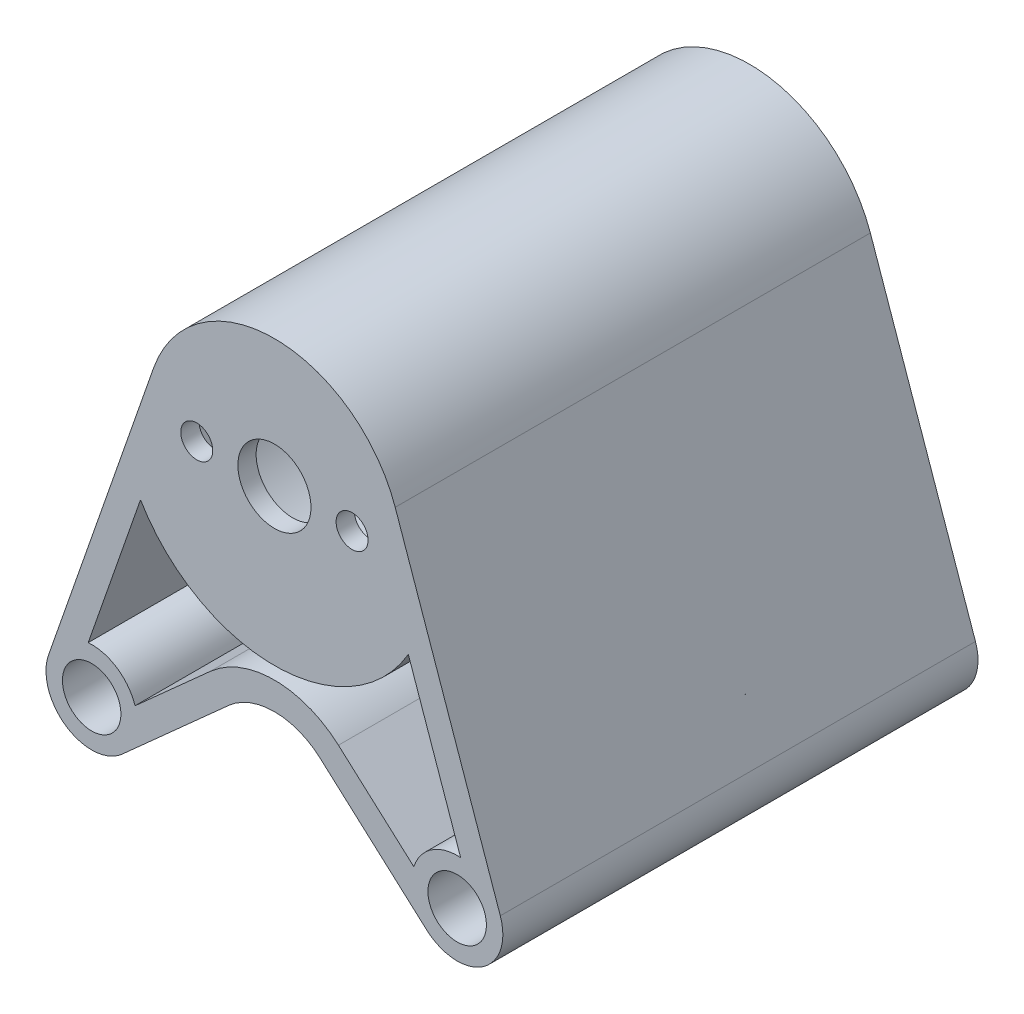
ISO-10303-21;
HEADER;
FILE_DESCRIPTION(('STEP AP214'),'2;1');
FILE_NAME('part.step','',(''),(''),'','','');
FILE_SCHEMA(('AUTOMOTIVE_DESIGN { 1 0 10303 214 1 1 1 1 }'));
ENDSEC;
DATA;
#1=APPLICATION_CONTEXT('core data for automotive mechanical design processes');
#2=APPLICATION_PROTOCOL_DEFINITION('international standard','automotive_design',2000,#1);
#3=PRODUCT_CONTEXT('',#1,'mechanical');
#4=PRODUCT('Part','Part','',(#3));
#5=PRODUCT_RELATED_PRODUCT_CATEGORY('part','',(#4));
#6=PRODUCT_DEFINITION_FORMATION('','',#4);
#7=PRODUCT_DEFINITION_CONTEXT('part definition',#1,'design');
#8=PRODUCT_DEFINITION('design','',#6,#7);
#9=PRODUCT_DEFINITION_SHAPE('','',#8);
#10=(LENGTH_UNIT() NAMED_UNIT(*) SI_UNIT(.MILLI.,.METRE.));
#11=(NAMED_UNIT(*) PLANE_ANGLE_UNIT() SI_UNIT($,.RADIAN.));
#12=(NAMED_UNIT(*) SI_UNIT($,.STERADIAN.) SOLID_ANGLE_UNIT());
#13=UNCERTAINTY_MEASURE_WITH_UNIT(LENGTH_MEASURE(1.E-05),#10,'distance_accuracy_value','');
#14=(GEOMETRIC_REPRESENTATION_CONTEXT(3) GLOBAL_UNCERTAINTY_ASSIGNED_CONTEXT((#13)) GLOBAL_UNIT_ASSIGNED_CONTEXT((#10,
#11,#12)) REPRESENTATION_CONTEXT('',''));
#15=CARTESIAN_POINT('',(0.,0.,0.));
#16=DIRECTION('',(0.,0.,1.));
#17=DIRECTION('',(1.,0.,0.));
#18=AXIS2_PLACEMENT_3D('',#15,#16,#17);
#19=CARTESIAN_POINT('',(0.,0.,2.));
#20=DIRECTION('',(0.,0.,-1.));
#21=DIRECTION('',(-1.,0.,0.));
#22=AXIS2_PLACEMENT_3D('',#19,#20,#21);
#23=CYLINDRICAL_SURFACE('',#22,14.);
#24=DIRECTION('',(0.,0.,1.));
#25=VECTOR('',#24,1.);
#26=CARTESIAN_POINT('',(-13.2184275462159,4.61228503081076,-113.789757213538));
#27=LINE('',#26,#25);
#28=CARTESIAN_POINT('',(-13.2184275462159,4.61228503081076,-50.));
#29=VERTEX_POINT('',#28);
#30=CARTESIAN_POINT('',(-13.2184275462159,4.61228503081076,2.));
#31=VERTEX_POINT('',#30);
#32=EDGE_CURVE('E70',#29,#31,#27,.T.);
#33=ORIENTED_EDGE('',*,*,#32,.T.);
#34=CARTESIAN_POINT('',(0.,0.,2.));
#35=DIRECTION('',(0.,0.,1.));
#36=DIRECTION('',(1.,0.,0.));
#37=AXIS2_PLACEMENT_3D('',#34,#35,#36);
#38=CIRCLE('',#37,14.);
#39=CARTESIAN_POINT('',(13.2184275462159,4.61228503081065,2.));
#40=VERTEX_POINT('',#39);
#41=EDGE_CURVE('E12',#40,#31,#38,.T.);
#42=ORIENTED_EDGE('',*,*,#41,.F.);
#43=DIRECTION('',(0.,0.,1.));
#44=VECTOR('',#43,1.);
#45=CARTESIAN_POINT('',(13.2184275462159,4.61228503081065,-113.789757213538));
#46=LINE('',#45,#44);
#47=CARTESIAN_POINT('',(13.2184275462159,4.61228503081065,-50.));
#48=VERTEX_POINT('',#47);
#49=EDGE_CURVE('E247',#48,#40,#46,.T.);
#50=ORIENTED_EDGE('',*,*,#49,.F.);
#51=CARTESIAN_POINT('',(0.,0.,-50.));
#52=DIRECTION('',(0.,0.,-1.));
#53=DIRECTION('',(-1.,0.,0.));
#54=AXIS2_PLACEMENT_3D('',#51,#52,#53);
#55=CIRCLE('',#54,14.);
#56=EDGE_CURVE('E199',#29,#48,#55,.T.);
#57=ORIENTED_EDGE('',*,*,#56,.F.);
#58=EDGE_LOOP('',(#33,#42,#50,#57));
#59=FACE_BOUND('',#58,.T.);
#60=ADVANCED_FACE('F53',(#59),#23,.T.);
#61=CARTESIAN_POINT('',(0.,0.,0.));
#62=DIRECTION('',(0.,0.,1.));
#63=DIRECTION('',(1.,0.,0.));
#64=AXIS2_PLACEMENT_3D('',#61,#62,#63);
#65=PLANE('',#64);
#66=CARTESIAN_POINT('',(8.49999999999959,1.32488214439315E-12,0.));
#67=DIRECTION('',(0.,0.,1.));
#68=DIRECTION('',(1.,0.,0.));
#69=AXIS2_PLACEMENT_3D('',#66,#67,#68);
#70=CIRCLE('',#69,1.75000000000002);
#71=CARTESIAN_POINT('',(10.2499999999996,1.32488214439315E-12,0.));
#72=VERTEX_POINT('',#71);
#73=EDGE_CURVE('E57',#72,#72,#70,.T.);
#74=ORIENTED_EDGE('',*,*,#73,.T.);
#75=EDGE_LOOP('',(#74));
#76=FACE_BOUND('',#75,.T.);
#77=CARTESIAN_POINT('',(-8.50000000000041,1.30695204254545E-12,0.));
#78=DIRECTION('',(0.,0.,1.));
#79=DIRECTION('',(1.,0.,0.));
#80=AXIS2_PLACEMENT_3D('',#77,#78,#79);
#81=CIRCLE('',#80,1.75000000000003);
#82=CARTESIAN_POINT('',(-6.75000000000038,1.30695204254545E-12,0.));
#83=VERTEX_POINT('',#82);
#84=EDGE_CURVE('E263',#83,#83,#81,.T.);
#85=ORIENTED_EDGE('',*,*,#84,.T.);
#86=EDGE_LOOP('',(#85));
#87=FACE_BOUND('',#86,.T.);
#88=CARTESIAN_POINT('',(0.,0.,0.));
#89=DIRECTION('',(0.,0.,1.));
#90=DIRECTION('',(1.,0.,0.));
#91=AXIS2_PLACEMENT_3D('',#88,#89,#90);
#92=CIRCLE('',#91,4.);
#93=CARTESIAN_POINT('',(4.,0.,0.));
#94=VERTEX_POINT('',#93);
#95=EDGE_CURVE('E202',#94,#94,#92,.T.);
#96=ORIENTED_EDGE('',*,*,#95,.T.);
#97=EDGE_LOOP('',(#96));
#98=FACE_BOUND('',#97,.T.);
#99=CARTESIAN_POINT('',(0.,0.,0.));
#100=DIRECTION('',(0.,0.,1.));
#101=DIRECTION('',(1.,0.,0.));
#102=AXIS2_PLACEMENT_3D('',#99,#100,#101);
#103=CIRCLE('',#102,13.15);
#104=CARTESIAN_POINT('',(13.15,0.,0.));
#105=VERTEX_POINT('',#104);
#106=EDGE_CURVE('E377',#105,#105,#103,.F.);
#107=ORIENTED_EDGE('',*,*,#106,.T.);
#108=EDGE_LOOP('',(#107));
#109=FACE_BOUND('',#108,.T.);
#110=ADVANCED_FACE('F270',(#76,#87,#98,#109),#65,.F.);
#111=CARTESIAN_POINT('',(8.49999999999959,1.32488214439315E-12,2.));
#112=DIRECTION('',(0.,0.,-1.));
#113=DIRECTION('',(-1.,0.,0.));
#114=AXIS2_PLACEMENT_3D('',#111,#112,#113);
#115=CYLINDRICAL_SURFACE('',#114,1.75000000000002);
#116=CARTESIAN_POINT('',(8.49999999999959,1.32488214439315E-12,2.));
#117=DIRECTION('',(0.,0.,1.));
#118=DIRECTION('',(1.,0.,0.));
#119=AXIS2_PLACEMENT_3D('',#116,#117,#118);
#120=CIRCLE('',#119,1.75000000000002);
#121=CARTESIAN_POINT('',(10.2499999999996,1.32488214439315E-12,2.));
#122=VERTEX_POINT('',#121);
#123=EDGE_CURVE('E62',#122,#122,#120,.T.);
#124=ORIENTED_EDGE('',*,*,#123,.T.);
#125=EDGE_LOOP('',(#124));
#126=FACE_BOUND('',#125,.T.);
#127=ORIENTED_EDGE('',*,*,#73,.F.);
#128=EDGE_LOOP('',(#127));
#129=FACE_BOUND('',#128,.T.);
#130=ADVANCED_FACE('F272',(#126,#129),#115,.F.);
#131=CARTESIAN_POINT('',(-8.50000000000041,1.30695204254545E-12,2.));
#132=DIRECTION('',(0.,0.,-1.));
#133=DIRECTION('',(-1.,0.,0.));
#134=AXIS2_PLACEMENT_3D('',#131,#132,#133);
#135=CYLINDRICAL_SURFACE('',#134,1.75000000000003);
#136=CARTESIAN_POINT('',(-8.50000000000041,1.30695204254545E-12,2.));
#137=DIRECTION('',(0.,0.,1.));
#138=DIRECTION('',(1.,0.,0.));
#139=AXIS2_PLACEMENT_3D('',#136,#137,#138);
#140=CIRCLE('',#139,1.75000000000003);
#141=CARTESIAN_POINT('',(-6.75000000000038,1.30695204254545E-12,2.));
#142=VERTEX_POINT('',#141);
#143=EDGE_CURVE('E257',#142,#142,#140,.T.);
#144=ORIENTED_EDGE('',*,*,#143,.T.);
#145=EDGE_LOOP('',(#144));
#146=FACE_BOUND('',#145,.T.);
#147=ORIENTED_EDGE('',*,*,#84,.F.);
#148=EDGE_LOOP('',(#147));
#149=FACE_BOUND('',#148,.T.);
#150=ADVANCED_FACE('F274',(#146,#149),#135,.F.);
#151=CARTESIAN_POINT('',(0.,0.,2.));
#152=DIRECTION('',(0.,0.,-1.));
#153=DIRECTION('',(-1.,0.,0.));
#154=AXIS2_PLACEMENT_3D('',#151,#152,#153);
#155=CYLINDRICAL_SURFACE('',#154,4.);
#156=CARTESIAN_POINT('',(0.,0.,2.));
#157=DIRECTION('',(0.,0.,1.));
#158=DIRECTION('',(1.,0.,0.));
#159=AXIS2_PLACEMENT_3D('',#156,#157,#158);
#160=CIRCLE('',#159,4.);
#161=CARTESIAN_POINT('',(4.,0.,2.));
#162=VERTEX_POINT('',#161);
#163=EDGE_CURVE('E254',#162,#162,#160,.T.);
#164=ORIENTED_EDGE('',*,*,#163,.T.);
#165=EDGE_LOOP('',(#164));
#166=FACE_BOUND('',#165,.T.);
#167=ORIENTED_EDGE('',*,*,#95,.F.);
#168=EDGE_LOOP('',(#167));
#169=FACE_BOUND('',#168,.T.);
#170=ADVANCED_FACE('F55',(#166,#169),#155,.F.);
#171=CARTESIAN_POINT('',(0.,0.,2.));
#172=DIRECTION('',(0.,0.,1.));
#173=DIRECTION('',(1.,0.,0.));
#174=AXIS2_PLACEMENT_3D('',#171,#172,#173);
#175=PLANE('',#174);
#176=CARTESIAN_POINT('',(19.9999999999998,-29.9999999999993,2.));
#177=DIRECTION('',(0.,0.,1.));
#178=DIRECTION('',(1.,0.,0.));
#179=AXIS2_PLACEMENT_3D('',#176,#177,#178);
#180=CIRCLE('',#179,3.19999999999996);
#181=CARTESIAN_POINT('',(23.1999999999998,-29.9999999999993,2.));
#182=VERTEX_POINT('',#181);
#183=EDGE_CURVE('E364',#182,#182,#180,.F.);
#184=ORIENTED_EDGE('',*,*,#183,.T.);
#185=EDGE_LOOP('',(#184));
#186=FACE_BOUND('',#185,.T.);
#187=CARTESIAN_POINT('',(-20.0000000000002,-29.9999999999993,2.));
#188=DIRECTION('',(0.,0.,1.));
#189=DIRECTION('',(1.,0.,0.));
#190=AXIS2_PLACEMENT_3D('',#187,#188,#189);
#191=CIRCLE('',#190,3.19999999999996);
#192=CARTESIAN_POINT('',(-16.8000000000002,-29.9999999999993,2.));
#193=VERTEX_POINT('',#192);
#194=EDGE_CURVE('E365',#193,#193,#191,.F.);
#195=ORIENTED_EDGE('',*,*,#194,.T.);
#196=EDGE_LOOP('',(#195));
#197=FACE_BOUND('',#196,.T.);
#198=ORIENTED_EDGE('',*,*,#163,.F.);
#199=EDGE_LOOP('',(#198));
#200=FACE_BOUND('',#199,.T.);
#201=ORIENTED_EDGE('',*,*,#143,.F.);
#202=EDGE_LOOP('',(#201));
#203=FACE_BOUND('',#202,.T.);
#204=ORIENTED_EDGE('',*,*,#123,.F.);
#205=EDGE_LOOP('',(#204));
#206=FACE_BOUND('',#205,.T.);
#207=ORIENTED_EDGE('',*,*,#41,.T.);
#208=DIRECTION('',(-0.329448930772197,-0.944173396158278,0.));
#209=VECTOR('',#208,1.);
#210=CARTESIAN_POINT('',(-13.2184275462159,4.61228503081076,2.));
#211=LINE('',#210,#209);
#212=CARTESIAN_POINT('',(-24.7208669807916,-28.3527553461384,2.));
#213=VERTEX_POINT('',#212);
#214=EDGE_CURVE('E401',#31,#213,#211,.T.);
#215=ORIENTED_EDGE('',*,*,#214,.T.);
#216=CARTESIAN_POINT('',(-20.0000000000002,-29.9999999999993,2.));
#217=DIRECTION('',(0.,0.,1.));
#218=DIRECTION('',(1.,0.,0.));
#219=AXIS2_PLACEMENT_3D('',#216,#217,#218);
#220=CIRCLE('',#219,4.99999999999997);
#221=CARTESIAN_POINT('',(-16.6637484038242,-33.7241677307833,2.));
#222=VERTEX_POINT('',#221);
#223=EDGE_CURVE('E394',#213,#222,#220,.T.);
#224=ORIENTED_EDGE('',*,*,#223,.T.);
#225=DIRECTION('',(-0.744833546156803,-0.667250319235204,0.));
#226=VECTOR('',#225,1.);
#227=CARTESIAN_POINT('',(9.34150446929246,-10.4276696461948,2.));
#228=LINE('',#227,#226);
#229=CARTESIAN_POINT('',(-5.00437739426418,-23.2792581689727,2.));
#230=VERTEX_POINT('',#229);
#231=EDGE_CURVE('E219',#230,#222,#228,.T.);
#232=ORIENTED_EDGE('',*,*,#231,.F.);
#233=CARTESIAN_POINT('',(-1.49764966330571E-13,-28.8655097651487,2.));
#234=DIRECTION('',(0.,0.,1.));
#235=DIRECTION('',(1.,0.,0.));
#236=AXIS2_PLACEMENT_3D('',#233,#234,#235);
#237=CIRCLE('',#236,7.5);
#238=CARTESIAN_POINT('',(5.00437739426388,-23.2792581689727,2.));
#239=VERTEX_POINT('',#238);
#240=EDGE_CURVE('E241',#239,#230,#237,.T.);
#241=ORIENTED_EDGE('',*,*,#240,.F.);
#242=DIRECTION('',(0.744833546156803,-0.667250319235204,0.));
#243=VECTOR('',#242,1.);
#244=CARTESIAN_POINT('',(-9.3415044692926,-10.4276696461949,2.));
#245=LINE('',#244,#243);
#246=CARTESIAN_POINT('',(16.6637484038238,-33.7241677307833,2.));
#247=VERTEX_POINT('',#246);
#248=EDGE_CURVE('E252',#239,#247,#245,.T.);
#249=ORIENTED_EDGE('',*,*,#248,.T.);
#250=CARTESIAN_POINT('',(19.9999999999998,-29.9999999999993,2.));
#251=DIRECTION('',(0.,0.,1.));
#252=DIRECTION('',(1.,0.,0.));
#253=AXIS2_PLACEMENT_3D('',#250,#251,#252);
#254=CIRCLE('',#253,5.);
#255=CARTESIAN_POINT('',(24.7208669807912,-28.3527553461384,2.));
#256=VERTEX_POINT('',#255);
#257=EDGE_CURVE('E404',#247,#256,#254,.T.);
#258=ORIENTED_EDGE('',*,*,#257,.T.);
#259=DIRECTION('',(0.329448930772189,-0.94417339615828,0.));
#260=VECTOR('',#259,1.);
#261=CARTESIAN_POINT('',(13.2184275462159,4.61228503081065,2.));
#262=LINE('',#261,#260);
#263=EDGE_CURVE('E249',#40,#256,#262,.T.);
#264=ORIENTED_EDGE('',*,*,#263,.F.);
#265=EDGE_LOOP('',(#207,#215,#224,#232,#241,#249,#258,#264));
#266=FACE_BOUND('',#265,.T.);
#267=DIRECTION('',(0.329448930772191,-0.94417339615828,0.));
#268=VECTOR('',#267,1.);
#269=CARTESIAN_POINT('',(10.3859073577411,3.62393823849409,2.));
#270=LINE('',#269,#268);
#271=CARTESIAN_POINT('',(14.6560535451456,-8.61394767117981,2.));
#272=VERTEX_POINT('',#271);
#273=CARTESIAN_POINT('',(20.3786221294306,-25.0143560813961,2.));
#274=VERTEX_POINT('',#273);
#275=EDGE_CURVE('E391',#272,#274,#270,.T.);
#276=ORIENTED_EDGE('',*,*,#275,.T.);
#277=CARTESIAN_POINT('',(15.2522432561235,-28.4319419969342,2.));
#278=VERTEX_POINT('',#277);
#279=EDGE_CURVE('E389',#274,#278,#254,.T.);
#280=ORIENTED_EDGE('',*,*,#279,.T.);
#281=DIRECTION('',(0.744833546156803,-0.667250319235204,0.));
#282=VECTOR('',#281,1.);
#283=CARTESIAN_POINT('',(-7.33975351158699,-8.19316900772455,2.));
#284=LINE('',#283,#282);
#285=CARTESIAN_POINT('',(7.00612835196949,-21.0447575305022,2.));
#286=VERTEX_POINT('',#285);
#287=EDGE_CURVE('E195',#286,#278,#284,.T.);
#288=ORIENTED_EDGE('',*,*,#287,.F.);
#289=CARTESIAN_POINT('',(-1.49764966330571E-13,-28.8655097651487,2.));
#290=DIRECTION('',(0.,0.,1.));
#291=DIRECTION('',(1.,0.,0.));
#292=AXIS2_PLACEMENT_3D('',#289,#290,#291);
#293=CIRCLE('',#292,10.5);
#294=CARTESIAN_POINT('',(-7.00612835196979,-21.0447575305022,2.));
#295=VERTEX_POINT('',#294);
#296=EDGE_CURVE('E191',#286,#295,#293,.T.);
#297=ORIENTED_EDGE('',*,*,#296,.T.);
#298=DIRECTION('',(-0.744833546156803,-0.667250319235204,0.));
#299=VECTOR('',#298,1.);
#300=CARTESIAN_POINT('',(7.33975351158686,-8.1931690077244,2.));
#301=LINE('',#300,#299);
#302=CARTESIAN_POINT('',(-15.2522432561238,-28.4319419969342,2.));
#303=VERTEX_POINT('',#302);
#304=EDGE_CURVE('E385',#295,#303,#301,.T.);
#305=ORIENTED_EDGE('',*,*,#304,.T.);
#306=CARTESIAN_POINT('',(-20.3786221294309,-25.0143560813961,2.));
#307=VERTEX_POINT('',#306);
#308=EDGE_CURVE('E382',#303,#307,#220,.T.);
#309=ORIENTED_EDGE('',*,*,#308,.T.);
#310=DIRECTION('',(-0.329448930772207,-0.944173396158274,0.));
#311=VECTOR('',#310,1.);
#312=CARTESIAN_POINT('',(-10.3859073577408,3.62393823849419,2.));
#313=LINE('',#312,#311);
#314=CARTESIAN_POINT('',(-14.6560535451456,-8.61394767117982,2.));
#315=VERTEX_POINT('',#314);
#316=EDGE_CURVE('E229',#315,#307,#313,.T.);
#317=ORIENTED_EDGE('',*,*,#316,.F.);
#318=CARTESIAN_POINT('',(0.,0.,2.));
#319=DIRECTION('',(0.,0.,1.));
#320=DIRECTION('',(1.,0.,0.));
#321=AXIS2_PLACEMENT_3D('',#318,#319,#320);
#322=CIRCLE('',#321,17.);
#323=EDGE_CURVE('E213',#315,#272,#322,.T.);
#324=ORIENTED_EDGE('',*,*,#323,.T.);
#325=EDGE_LOOP('',(#276,#280,#288,#297,#305,#309,#317,#324));
#326=FACE_BOUND('',#325,.T.);
#327=ADVANCED_FACE('F289',(#186,#197,#200,#203,#206,#266,#326),#175,.T.);
#328=CARTESIAN_POINT('',(0.,0.,-50.));
#329=DIRECTION('',(0.,0.,-1.));
#330=DIRECTION('',(-1.,0.,0.));
#331=AXIS2_PLACEMENT_3D('',#328,#329,#330);
#332=PLANE('',#331);
#333=CARTESIAN_POINT('',(19.9999999999998,-29.9999999999993,-50.));
#334=DIRECTION('',(0.,0.,-1.));
#335=DIRECTION('',(-1.,0.,0.));
#336=AXIS2_PLACEMENT_3D('',#333,#334,#335);
#337=CIRCLE('',#336,3.19999999999996);
#338=CARTESIAN_POINT('',(16.7999999999999,-29.9999999999993,-50.));
#339=VERTEX_POINT('',#338);
#340=EDGE_CURVE('E361',#339,#339,#337,.T.);
#341=ORIENTED_EDGE('',*,*,#340,.F.);
#342=EDGE_LOOP('',(#341));
#343=FACE_BOUND('',#342,.T.);
#344=CARTESIAN_POINT('',(-20.0000000000002,-29.9999999999993,-50.));
#345=DIRECTION('',(0.,0.,-1.));
#346=DIRECTION('',(-1.,0.,0.));
#347=AXIS2_PLACEMENT_3D('',#344,#345,#346);
#348=CIRCLE('',#347,3.19999999999996);
#349=CARTESIAN_POINT('',(-23.2000000000001,-29.9999999999993,-50.));
#350=VERTEX_POINT('',#349);
#351=EDGE_CURVE('E370',#350,#350,#348,.T.);
#352=ORIENTED_EDGE('',*,*,#351,.F.);
#353=EDGE_LOOP('',(#352));
#354=FACE_BOUND('',#353,.T.);
#355=CARTESIAN_POINT('',(0.,0.,-50.));
#356=DIRECTION('',(0.,0.,-1.));
#357=DIRECTION('',(-1.,0.,0.));
#358=AXIS2_PLACEMENT_3D('',#355,#356,#357);
#359=CIRCLE('',#358,13.15);
#360=CARTESIAN_POINT('',(-13.15,0.,-50.));
#361=VERTEX_POINT('',#360);
#362=EDGE_CURVE('E367',#361,#361,#359,.T.);
#363=ORIENTED_EDGE('',*,*,#362,.F.);
#364=EDGE_LOOP('',(#363));
#365=FACE_BOUND('',#364,.T.);
#366=ORIENTED_EDGE('',*,*,#56,.T.);
#367=DIRECTION('',(0.329448930772189,-0.944173396158281,0.));
#368=VECTOR('',#367,1.);
#369=CARTESIAN_POINT('',(13.2184275462159,4.61228503081065,-50.));
#370=LINE('',#369,#368);
#371=CARTESIAN_POINT('',(24.7208669807912,-28.3527553461384,-50.));
#372=VERTEX_POINT('',#371);
#373=EDGE_CURVE('E114',#48,#372,#370,.T.);
#374=ORIENTED_EDGE('',*,*,#373,.T.);
#375=CARTESIAN_POINT('',(19.9999999999998,-29.9999999999993,-50.));
#376=DIRECTION('',(0.,0.,-1.));
#377=DIRECTION('',(-1.,0.,0.));
#378=AXIS2_PLACEMENT_3D('',#375,#376,#377);
#379=CIRCLE('',#378,5.);
#380=CARTESIAN_POINT('',(16.6637484038238,-33.7241677307833,-50.));
#381=VERTEX_POINT('',#380);
#382=EDGE_CURVE('E108',#381,#372,#379,.F.);
#383=ORIENTED_EDGE('',*,*,#382,.F.);
#384=DIRECTION('',(0.744833546156803,-0.667250319235204,0.));
#385=VECTOR('',#384,1.);
#386=CARTESIAN_POINT('',(-9.3415044692926,-10.4276696461949,-50.));
#387=LINE('',#386,#385);
#388=CARTESIAN_POINT('',(5.00437739426388,-23.2792581689727,-50.));
#389=VERTEX_POINT('',#388);
#390=EDGE_CURVE('E207',#389,#381,#387,.T.);
#391=ORIENTED_EDGE('',*,*,#390,.F.);
#392=CARTESIAN_POINT('',(-1.49764966330571E-13,-28.8655097651487,-50.));
#393=DIRECTION('',(0.,0.,-1.));
#394=DIRECTION('',(-1.,0.,0.));
#395=AXIS2_PLACEMENT_3D('',#392,#393,#394);
#396=CIRCLE('',#395,7.5);
#397=CARTESIAN_POINT('',(-5.00437739426418,-23.2792581689727,-50.));
#398=VERTEX_POINT('',#397);
#399=EDGE_CURVE('E210',#389,#398,#396,.F.);
#400=ORIENTED_EDGE('',*,*,#399,.T.);
#401=DIRECTION('',(-0.744833546156803,-0.667250319235204,0.));
#402=VECTOR('',#401,1.);
#403=CARTESIAN_POINT('',(9.34150446929246,-10.4276696461948,-50.));
#404=LINE('',#403,#402);
#405=CARTESIAN_POINT('',(-16.6637484038242,-33.7241677307833,-50.));
#406=VERTEX_POINT('',#405);
#407=EDGE_CURVE('E212',#398,#406,#404,.T.);
#408=ORIENTED_EDGE('',*,*,#407,.T.);
#409=CARTESIAN_POINT('',(-20.0000000000002,-29.9999999999993,-50.));
#410=DIRECTION('',(0.,0.,-1.));
#411=DIRECTION('',(-1.,0.,0.));
#412=AXIS2_PLACEMENT_3D('',#409,#410,#411);
#413=CIRCLE('',#412,4.99999999999997);
#414=CARTESIAN_POINT('',(-24.7208669807916,-28.3527553461384,-50.));
#415=VERTEX_POINT('',#414);
#416=EDGE_CURVE('E215',#415,#406,#413,.F.);
#417=ORIENTED_EDGE('',*,*,#416,.F.);
#418=DIRECTION('',(-0.329448930772197,-0.944173396158278,0.));
#419=VECTOR('',#418,1.);
#420=CARTESIAN_POINT('',(-13.2184275462159,4.61228503081076,-50.));
#421=LINE('',#420,#419);
#422=EDGE_CURVE('E220',#29,#415,#421,.T.);
#423=ORIENTED_EDGE('',*,*,#422,.F.);
#424=EDGE_LOOP('',(#366,#374,#383,#391,#400,#408,#417,#423));
#425=FACE_BOUND('',#424,.T.);
#426=DIRECTION('',(0.329448930772191,-0.94417339615828,0.));
#427=VECTOR('',#426,1.);
#428=CARTESIAN_POINT('',(10.3859073577411,3.62393823849409,-50.));
#429=LINE('',#428,#427);
#430=CARTESIAN_POINT('',(14.6560535451456,-8.61394767117981,-50.));
#431=VERTEX_POINT('',#430);
#432=CARTESIAN_POINT('',(20.3786221294306,-25.0143560813961,-50.));
#433=VERTEX_POINT('',#432);
#434=EDGE_CURVE('E238',#431,#433,#429,.T.);
#435=ORIENTED_EDGE('',*,*,#434,.F.);
#436=CARTESIAN_POINT('',(0.,0.,-50.));
#437=DIRECTION('',(0.,0.,-1.));
#438=DIRECTION('',(-1.,0.,0.));
#439=AXIS2_PLACEMENT_3D('',#436,#437,#438);
#440=CIRCLE('',#439,17.);
#441=CARTESIAN_POINT('',(-14.6560535451456,-8.61394767117982,-50.));
#442=VERTEX_POINT('',#441);
#443=EDGE_CURVE('E227',#442,#431,#440,.F.);
#444=ORIENTED_EDGE('',*,*,#443,.F.);
#445=DIRECTION('',(-0.329448930772207,-0.944173396158274,0.));
#446=VECTOR('',#445,1.);
#447=CARTESIAN_POINT('',(-10.3859073577408,3.62393823849419,-50.));
#448=LINE('',#447,#446);
#449=CARTESIAN_POINT('',(-20.3786221294309,-25.0143560813962,-50.));
#450=VERTEX_POINT('',#449);
#451=EDGE_CURVE('E200',#442,#450,#448,.T.);
#452=ORIENTED_EDGE('',*,*,#451,.T.);
#453=CARTESIAN_POINT('',(-20.0000000000002,-29.9999999999993,-50.));
#454=DIRECTION('',(0.,0.,-1.));
#455=DIRECTION('',(-1.,0.,0.));
#456=AXIS2_PLACEMENT_3D('',#453,#454,#455);
#457=CIRCLE('',#456,4.99999999999997);
#458=CARTESIAN_POINT('',(-15.2522432561238,-28.4319419969342,-50.));
#459=VERTEX_POINT('',#458);
#460=EDGE_CURVE('E232',#459,#450,#457,.F.);
#461=ORIENTED_EDGE('',*,*,#460,.F.);
#462=DIRECTION('',(-0.744833546156803,-0.667250319235204,0.));
#463=VECTOR('',#462,1.);
#464=CARTESIAN_POINT('',(7.33975351158686,-8.1931690077244,-50.));
#465=LINE('',#464,#463);
#466=CARTESIAN_POINT('',(-7.00612835196979,-21.0447575305022,-50.));
#467=VERTEX_POINT('',#466);
#468=EDGE_CURVE('E174',#467,#459,#465,.T.);
#469=ORIENTED_EDGE('',*,*,#468,.F.);
#470=CARTESIAN_POINT('',(-1.49764966330571E-13,-28.8655097651487,-50.));
#471=DIRECTION('',(0.,0.,-1.));
#472=DIRECTION('',(-1.,0.,0.));
#473=AXIS2_PLACEMENT_3D('',#470,#471,#472);
#474=CIRCLE('',#473,10.5);
#475=CARTESIAN_POINT('',(7.00612835196949,-21.0447575305022,-50.));
#476=VERTEX_POINT('',#475);
#477=EDGE_CURVE('E177',#476,#467,#474,.F.);
#478=ORIENTED_EDGE('',*,*,#477,.F.);
#479=DIRECTION('',(0.744833546156803,-0.667250319235204,0.));
#480=VECTOR('',#479,1.);
#481=CARTESIAN_POINT('',(-7.33975351158699,-8.19316900772455,-50.));
#482=LINE('',#481,#480);
#483=CARTESIAN_POINT('',(15.2522432561235,-28.4319419969342,-50.));
#484=VERTEX_POINT('',#483);
#485=EDGE_CURVE('E181',#476,#484,#482,.T.);
#486=ORIENTED_EDGE('',*,*,#485,.T.);
#487=CARTESIAN_POINT('',(19.9999999999998,-29.9999999999993,-50.));
#488=DIRECTION('',(0.,0.,-1.));
#489=DIRECTION('',(-1.,0.,0.));
#490=AXIS2_PLACEMENT_3D('',#487,#488,#489);
#491=CIRCLE('',#490,5.);
#492=EDGE_CURVE('E79',#433,#484,#491,.F.);
#493=ORIENTED_EDGE('',*,*,#492,.F.);
#494=EDGE_LOOP('',(#435,#444,#452,#461,#469,#478,#486,#493));
#495=FACE_BOUND('',#494,.T.);
#496=ADVANCED_FACE('F179',(#343,#354,#365,#425,#495),#332,.T.);
#497=CARTESIAN_POINT('',(10.3859073577411,3.62393823849409,-113.789757213538));
#498=DIRECTION('',(-0.94417339615828,-0.329448930772191,0.));
#499=DIRECTION('',(0.329448930772191,-0.94417339615828,0.));
#500=AXIS2_PLACEMENT_3D('',#497,#498,#499);
#501=PLANE('',#500);
#502=DIRECTION('',(0.,0.,1.));
#503=VECTOR('',#502,1.);
#504=CARTESIAN_POINT('',(14.6560535451456,-8.61394767117981,-113.789757213538));
#505=LINE('',#504,#503);
#506=EDGE_CURVE('E224',#431,#272,#505,.T.);
#507=ORIENTED_EDGE('',*,*,#506,.F.);
#508=ORIENTED_EDGE('',*,*,#434,.T.);
#509=DIRECTION('',(0.,0.,1.));
#510=VECTOR('',#509,1.);
#511=CARTESIAN_POINT('',(20.3786221294306,-25.0143560813961,-113.789757213538));
#512=LINE('',#511,#510);
#513=EDGE_CURVE('E236',#433,#274,#512,.T.);
#514=ORIENTED_EDGE('',*,*,#513,.T.);
#515=ORIENTED_EDGE('',*,*,#275,.F.);
#516=EDGE_LOOP('',(#507,#508,#514,#515));
#517=FACE_BOUND('',#516,.T.);
#518=ADVANCED_FACE('F295',(#517),#501,.T.);
#519=CARTESIAN_POINT('',(0.,0.,-113.789757213538));
#520=DIRECTION('',(0.,0.,1.));
#521=DIRECTION('',(1.,0.,0.));
#522=AXIS2_PLACEMENT_3D('',#519,#520,#521);
#523=CYLINDRICAL_SURFACE('',#522,17.);
#524=DIRECTION('',(0.,0.,1.));
#525=VECTOR('',#524,1.);
#526=CARTESIAN_POINT('',(-14.6560535451456,-8.61394767117982,-113.789757213538));
#527=LINE('',#526,#525);
#528=EDGE_CURVE('E226',#442,#315,#527,.T.);
#529=ORIENTED_EDGE('',*,*,#528,.F.);
#530=ORIENTED_EDGE('',*,*,#443,.T.);
#531=ORIENTED_EDGE('',*,*,#506,.T.);
#532=ORIENTED_EDGE('',*,*,#323,.F.);
#533=EDGE_LOOP('',(#529,#530,#531,#532));
#534=FACE_BOUND('',#533,.T.);
#535=ADVANCED_FACE('F320',(#534),#523,.T.);
#536=CARTESIAN_POINT('',(-10.3859073577408,3.62393823849419,-113.789757213538));
#537=DIRECTION('',(-0.944173396158274,0.329448930772207,0.));
#538=DIRECTION('',(-0.329448930772207,-0.944173396158274,0.));
#539=AXIS2_PLACEMENT_3D('',#536,#537,#538);
#540=PLANE('',#539);
#541=ORIENTED_EDGE('',*,*,#451,.F.);
#542=ORIENTED_EDGE('',*,*,#528,.T.);
#543=ORIENTED_EDGE('',*,*,#316,.T.);
#544=DIRECTION('',(0.,0.,1.));
#545=VECTOR('',#544,1.);
#546=CARTESIAN_POINT('',(-20.3786221294309,-25.0143560813961,-113.789757213538));
#547=LINE('',#546,#545);
#548=EDGE_CURVE('E230',#450,#307,#547,.T.);
#549=ORIENTED_EDGE('',*,*,#548,.F.);
#550=EDGE_LOOP('',(#541,#542,#543,#549));
#551=FACE_BOUND('',#550,.T.);
#552=ADVANCED_FACE('F324',(#551),#540,.F.);
#553=CARTESIAN_POINT('',(-20.0000000000002,-29.9999999999993,-113.789757213538));
#554=DIRECTION('',(0.,0.,1.));
#555=DIRECTION('',(1.,0.,0.));
#556=AXIS2_PLACEMENT_3D('',#553,#554,#555);
#557=CYLINDRICAL_SURFACE('',#556,4.99999999999997);
#558=DIRECTION('',(0.,0.,1.));
#559=VECTOR('',#558,1.);
#560=CARTESIAN_POINT('',(-15.2522432561238,-28.4319419969342,-113.789757213538));
#561=LINE('',#560,#559);
#562=EDGE_CURVE('E185',#459,#303,#561,.T.);
#563=ORIENTED_EDGE('',*,*,#562,.F.);
#564=ORIENTED_EDGE('',*,*,#460,.T.);
#565=ORIENTED_EDGE('',*,*,#548,.T.);
#566=ORIENTED_EDGE('',*,*,#308,.F.);
#567=EDGE_LOOP('',(#563,#564,#565,#566));
#568=FACE_BOUND('',#567,.T.);
#569=ADVANCED_FACE('F328',(#568),#557,.T.);
#570=CARTESIAN_POINT('',(7.33975351158686,-8.1931690077244,-113.789757213538));
#571=DIRECTION('',(-0.667250319235204,0.744833546156803,0.));
#572=DIRECTION('',(-0.744833546156803,-0.667250319235204,0.));
#573=AXIS2_PLACEMENT_3D('',#570,#571,#572);
#574=PLANE('',#573);
#575=DIRECTION('',(0.,0.,1.));
#576=VECTOR('',#575,1.);
#577=CARTESIAN_POINT('',(-7.00612835196979,-21.0447575305022,-113.789757213538));
#578=LINE('',#577,#576);
#579=EDGE_CURVE('E184',#467,#295,#578,.T.);
#580=ORIENTED_EDGE('',*,*,#579,.F.);
#581=ORIENTED_EDGE('',*,*,#468,.T.);
#582=ORIENTED_EDGE('',*,*,#562,.T.);
#583=ORIENTED_EDGE('',*,*,#304,.F.);
#584=EDGE_LOOP('',(#580,#581,#582,#583));
#585=FACE_BOUND('',#584,.T.);
#586=ADVANCED_FACE('F332',(#585),#574,.T.);
#587=CARTESIAN_POINT('',(-1.49764966330571E-13,-28.8655097651487,-113.789757213538));
#588=DIRECTION('',(0.,0.,1.));
#589=DIRECTION('',(1.,0.,0.));
#590=AXIS2_PLACEMENT_3D('',#587,#588,#589);
#591=CYLINDRICAL_SURFACE('',#590,10.5);
#592=DIRECTION('',(0.,0.,1.));
#593=VECTOR('',#592,1.);
#594=CARTESIAN_POINT('',(7.00612835196949,-21.0447575305022,-113.789757213538));
#595=LINE('',#594,#593);
#596=EDGE_CURVE('E188',#476,#286,#595,.T.);
#597=ORIENTED_EDGE('',*,*,#596,.F.);
#598=ORIENTED_EDGE('',*,*,#477,.T.);
#599=ORIENTED_EDGE('',*,*,#579,.T.);
#600=ORIENTED_EDGE('',*,*,#296,.F.);
#601=EDGE_LOOP('',(#597,#598,#599,#600));
#602=FACE_BOUND('',#601,.T.);
#603=ADVANCED_FACE('F189',(#602),#591,.T.);
#604=CARTESIAN_POINT('',(-7.33975351158699,-8.19316900772455,-113.789757213538));
#605=DIRECTION('',(-0.667250319235204,-0.744833546156803,0.));
#606=DIRECTION('',(0.744833546156803,-0.667250319235204,0.));
#607=AXIS2_PLACEMENT_3D('',#604,#605,#606);
#608=PLANE('',#607);
#609=ORIENTED_EDGE('',*,*,#485,.F.);
#610=ORIENTED_EDGE('',*,*,#596,.T.);
#611=ORIENTED_EDGE('',*,*,#287,.T.);
#612=DIRECTION('',(0.,0.,1.));
#613=VECTOR('',#612,1.);
#614=CARTESIAN_POINT('',(15.2522432561235,-28.4319419969342,-113.789757213538));
#615=LINE('',#614,#613);
#616=EDGE_CURVE('E198',#484,#278,#615,.T.);
#617=ORIENTED_EDGE('',*,*,#616,.F.);
#618=EDGE_LOOP('',(#609,#610,#611,#617));
#619=FACE_BOUND('',#618,.T.);
#620=ADVANCED_FACE('F197',(#619),#608,.F.);
#621=CARTESIAN_POINT('',(-9.3415044692926,-10.4276696461949,-113.789757213538));
#622=DIRECTION('',(-0.667250319235204,-0.744833546156803,0.));
#623=DIRECTION('',(0.744833546156803,-0.667250319235204,0.));
#624=AXIS2_PLACEMENT_3D('',#621,#622,#623);
#625=PLANE('',#624);
#626=DIRECTION('',(0.,0.,1.));
#627=VECTOR('',#626,1.);
#628=CARTESIAN_POINT('',(5.00437739426388,-23.2792581689727,-113.789757213538));
#629=LINE('',#628,#627);
#630=EDGE_CURVE('E239',#389,#239,#629,.T.);
#631=ORIENTED_EDGE('',*,*,#630,.F.);
#632=ORIENTED_EDGE('',*,*,#390,.T.);
#633=DIRECTION('',(0.,0.,1.));
#634=VECTOR('',#633,1.);
#635=CARTESIAN_POINT('',(16.6637484038238,-33.7241677307833,-113.789757213538));
#636=LINE('',#635,#634);
#637=EDGE_CURVE('E209',#381,#247,#636,.T.);
#638=ORIENTED_EDGE('',*,*,#637,.T.);
#639=ORIENTED_EDGE('',*,*,#248,.F.);
#640=EDGE_LOOP('',(#631,#632,#638,#639));
#641=FACE_BOUND('',#640,.T.);
#642=ADVANCED_FACE('F297',(#641),#625,.T.);
#643=CARTESIAN_POINT('',(-1.49764966330571E-13,-28.8655097651487,-113.789757213538));
#644=DIRECTION('',(0.,0.,1.));
#645=DIRECTION('',(1.,0.,0.));
#646=AXIS2_PLACEMENT_3D('',#643,#644,#645);
#647=CYLINDRICAL_SURFACE('',#646,7.5);
#648=ORIENTED_EDGE('',*,*,#399,.F.);
#649=ORIENTED_EDGE('',*,*,#630,.T.);
#650=ORIENTED_EDGE('',*,*,#240,.T.);
#651=DIRECTION('',(0.,0.,1.));
#652=VECTOR('',#651,1.);
#653=CARTESIAN_POINT('',(-5.00437739426418,-23.2792581689727,-113.789757213538));
#654=LINE('',#653,#652);
#655=EDGE_CURVE('E242',#398,#230,#654,.T.);
#656=ORIENTED_EDGE('',*,*,#655,.F.);
#657=EDGE_LOOP('',(#648,#649,#650,#656));
#658=FACE_BOUND('',#657,.T.);
#659=ADVANCED_FACE('F300',(#658),#647,.F.);
#660=CARTESIAN_POINT('',(9.34150446929246,-10.4276696461948,-113.789757213538));
#661=DIRECTION('',(-0.667250319235204,0.744833546156803,0.));
#662=DIRECTION('',(-0.744833546156803,-0.667250319235204,0.));
#663=AXIS2_PLACEMENT_3D('',#660,#661,#662);
#664=PLANE('',#663);
#665=ORIENTED_EDGE('',*,*,#407,.F.);
#666=ORIENTED_EDGE('',*,*,#655,.T.);
#667=ORIENTED_EDGE('',*,*,#231,.T.);
#668=DIRECTION('',(0.,0.,1.));
#669=VECTOR('',#668,1.);
#670=CARTESIAN_POINT('',(-16.6637484038242,-33.7241677307833,-113.789757213538));
#671=LINE('',#670,#669);
#672=EDGE_CURVE('E218',#406,#222,#671,.T.);
#673=ORIENTED_EDGE('',*,*,#672,.F.);
#674=EDGE_LOOP('',(#665,#666,#667,#673));
#675=FACE_BOUND('',#674,.T.);
#676=ADVANCED_FACE('F304',(#675),#664,.F.);
#677=DIRECTION('',(0.,0.,1.));
#678=VECTOR('',#677,1.);
#679=CARTESIAN_POINT('',(-24.7208669807916,-28.3527553461384,-113.789757213538));
#680=LINE('',#679,#678);
#681=EDGE_CURVE('E222',#415,#213,#680,.T.);
#682=ORIENTED_EDGE('',*,*,#681,.F.);
#683=ORIENTED_EDGE('',*,*,#416,.T.);
#684=ORIENTED_EDGE('',*,*,#672,.T.);
#685=ORIENTED_EDGE('',*,*,#223,.F.);
#686=EDGE_LOOP('',(#682,#683,#684,#685));
#687=FACE_BOUND('',#686,.T.);
#688=ADVANCED_FACE('F308',(#687),#557,.T.);
#689=CARTESIAN_POINT('',(-13.2184275462159,4.61228503081076,-113.789757213538));
#690=DIRECTION('',(-0.944173396158278,0.329448930772197,0.));
#691=DIRECTION('',(-0.329448930772197,-0.944173396158278,0.));
#692=AXIS2_PLACEMENT_3D('',#689,#690,#691);
#693=PLANE('',#692);
#694=ORIENTED_EDGE('',*,*,#32,.F.);
#695=ORIENTED_EDGE('',*,*,#422,.T.);
#696=ORIENTED_EDGE('',*,*,#681,.T.);
#697=ORIENTED_EDGE('',*,*,#214,.F.);
#698=EDGE_LOOP('',(#694,#695,#696,#697));
#699=FACE_BOUND('',#698,.T.);
#700=ADVANCED_FACE('F310',(#699),#693,.T.);
#701=CARTESIAN_POINT('',(13.2184275462159,4.61228503081065,-113.789757213538));
#702=DIRECTION('',(-0.944173396158281,-0.329448930772189,0.));
#703=DIRECTION('',(0.329448930772189,-0.944173396158281,0.));
#704=AXIS2_PLACEMENT_3D('',#701,#702,#703);
#705=PLANE('',#704);
#706=ORIENTED_EDGE('',*,*,#373,.F.);
#707=ORIENTED_EDGE('',*,*,#49,.T.);
#708=ORIENTED_EDGE('',*,*,#263,.T.);
#709=DIRECTION('',(0.,0.,1.));
#710=VECTOR('',#709,1.);
#711=CARTESIAN_POINT('',(24.7208669807912,-28.3527553461384,-113.789757213538));
#712=LINE('',#711,#710);
#713=EDGE_CURVE('E250',#372,#256,#712,.T.);
#714=ORIENTED_EDGE('',*,*,#713,.F.);
#715=EDGE_LOOP('',(#706,#707,#708,#714));
#716=FACE_BOUND('',#715,.T.);
#717=ADVANCED_FACE('F313',(#716),#705,.F.);
#718=CARTESIAN_POINT('',(19.9999999999998,-29.9999999999993,-113.789757213538));
#719=DIRECTION('',(0.,0.,1.));
#720=DIRECTION('',(1.,0.,0.));
#721=AXIS2_PLACEMENT_3D('',#718,#719,#720);
#722=CYLINDRICAL_SURFACE('',#721,5.);
#723=ORIENTED_EDGE('',*,*,#513,.F.);
#724=ORIENTED_EDGE('',*,*,#492,.T.);
#725=ORIENTED_EDGE('',*,*,#616,.T.);
#726=ORIENTED_EDGE('',*,*,#279,.F.);
#727=EDGE_LOOP('',(#723,#724,#725,#726));
#728=FACE_BOUND('',#727,.T.);
#729=ADVANCED_FACE('F316',(#728),#722,.T.);
#730=ORIENTED_EDGE('',*,*,#637,.F.);
#731=ORIENTED_EDGE('',*,*,#382,.T.);
#732=ORIENTED_EDGE('',*,*,#713,.T.);
#733=ORIENTED_EDGE('',*,*,#257,.F.);
#734=EDGE_LOOP('',(#730,#731,#732,#733));
#735=FACE_BOUND('',#734,.T.);
#736=ADVANCED_FACE('F343',(#735),#722,.T.);
#737=CARTESIAN_POINT('',(0.,0.,37.1938166904124));
#738=DIRECTION('',(0.,0.,-1.));
#739=DIRECTION('',(-1.,0.,0.));
#740=AXIS2_PLACEMENT_3D('',#737,#738,#739);
#741=CYLINDRICAL_SURFACE('',#740,13.15);
#742=ORIENTED_EDGE('',*,*,#362,.T.);
#743=EDGE_LOOP('',(#742));
#744=FACE_BOUND('',#743,.T.);
#745=ORIENTED_EDGE('',*,*,#106,.F.);
#746=EDGE_LOOP('',(#745));
#747=FACE_BOUND('',#746,.T.);
#748=ADVANCED_FACE('F345',(#744,#747),#741,.F.);
#749=CARTESIAN_POINT('',(-20.0000000000002,-29.9999999999993,11.0509667991877));
#750=DIRECTION('',(0.,0.,-1.));
#751=DIRECTION('',(-1.,0.,0.));
#752=AXIS2_PLACEMENT_3D('',#749,#750,#751);
#753=CYLINDRICAL_SURFACE('',#752,3.19999999999996);
#754=ORIENTED_EDGE('',*,*,#351,.T.);
#755=EDGE_LOOP('',(#754));
#756=FACE_BOUND('',#755,.T.);
#757=ORIENTED_EDGE('',*,*,#194,.F.);
#758=EDGE_LOOP('',(#757));
#759=FACE_BOUND('',#758,.T.);
#760=ADVANCED_FACE('F348',(#756,#759),#753,.F.);
#761=CARTESIAN_POINT('',(19.9999999999998,-29.9999999999993,11.0509667991877));
#762=DIRECTION('',(0.,0.,-1.));
#763=DIRECTION('',(-1.,0.,0.));
#764=AXIS2_PLACEMENT_3D('',#761,#762,#763);
#765=CYLINDRICAL_SURFACE('',#764,3.19999999999996);
#766=ORIENTED_EDGE('',*,*,#340,.T.);
#767=EDGE_LOOP('',(#766));
#768=FACE_BOUND('',#767,.T.);
#769=ORIENTED_EDGE('',*,*,#183,.F.);
#770=EDGE_LOOP('',(#769));
#771=FACE_BOUND('',#770,.T.);
#772=ADVANCED_FACE('F352',(#768,#771),#765,.F.);
#773=CLOSED_SHELL('',(#60,#110,#130,#150,#170,#327,#496,#518,#535,#552,#569,#586,#603,#620,#642,
#659,#676,#688,#700,#717,#729,#736,#748,#760,#772));
#774=MANIFOLD_SOLID_BREP('B2',#773);
#775=ADVANCED_BREP_SHAPE_REPRESENTATION('',(#18,#774),#14);
#776=SHAPE_DEFINITION_REPRESENTATION(#9,#775);
ENDSEC;
END-ISO-10303-21;
